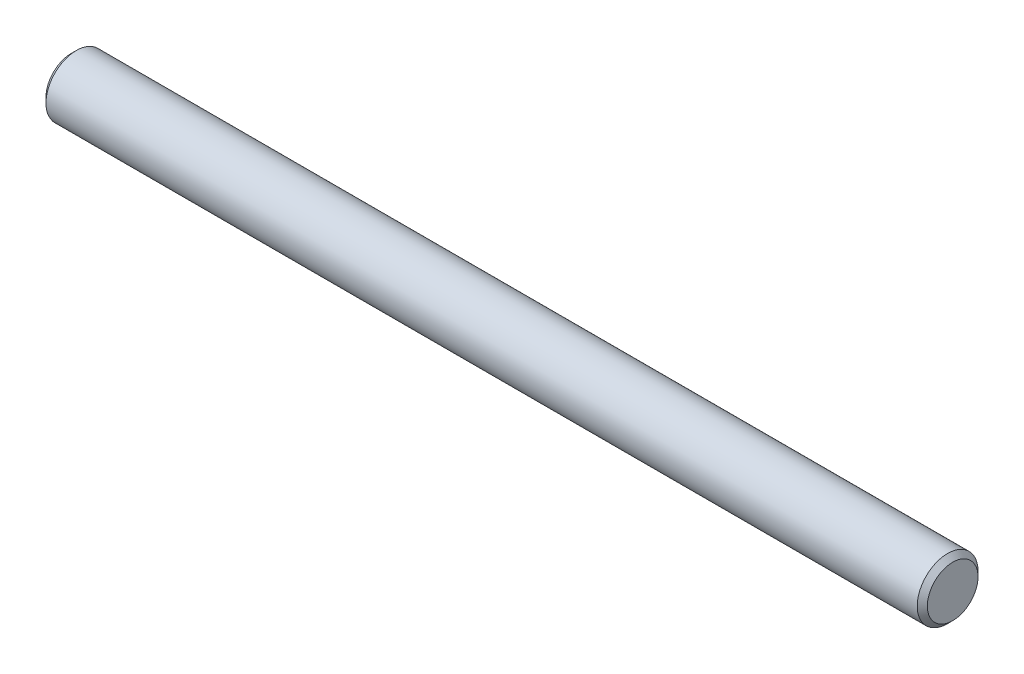
ISO-10303-21;
HEADER;
FILE_DESCRIPTION(('STEP AP214'),'2;1');
FILE_NAME('part.step','',(''),(''),'','','');
FILE_SCHEMA(('AUTOMOTIVE_DESIGN { 1 0 10303 214 1 1 1 1 }'));
ENDSEC;
DATA;
#1=APPLICATION_CONTEXT('core data for automotive mechanical design processes');
#2=APPLICATION_PROTOCOL_DEFINITION('international standard','automotive_design',2000,#1);
#3=PRODUCT_CONTEXT('',#1,'mechanical');
#4=PRODUCT('Part','Part','',(#3));
#5=PRODUCT_RELATED_PRODUCT_CATEGORY('part','',(#4));
#6=PRODUCT_DEFINITION_FORMATION('','',#4);
#7=PRODUCT_DEFINITION_CONTEXT('part definition',#1,'design');
#8=PRODUCT_DEFINITION('design','',#6,#7);
#9=PRODUCT_DEFINITION_SHAPE('','',#8);
#10=(LENGTH_UNIT() NAMED_UNIT(*) SI_UNIT(.MILLI.,.METRE.));
#11=(NAMED_UNIT(*) PLANE_ANGLE_UNIT() SI_UNIT($,.RADIAN.));
#12=(NAMED_UNIT(*) SI_UNIT($,.STERADIAN.) SOLID_ANGLE_UNIT());
#13=UNCERTAINTY_MEASURE_WITH_UNIT(LENGTH_MEASURE(1.E-05),#10,'distance_accuracy_value','');
#14=(GEOMETRIC_REPRESENTATION_CONTEXT(3) GLOBAL_UNCERTAINTY_ASSIGNED_CONTEXT((#13)) GLOBAL_UNIT_ASSIGNED_CONTEXT((#10,
#11,#12)) REPRESENTATION_CONTEXT('',''));
#15=CARTESIAN_POINT('',(0.,0.,0.));
#16=DIRECTION('',(0.,0.,1.));
#17=DIRECTION('',(1.,0.,0.));
#18=AXIS2_PLACEMENT_3D('',#15,#16,#17);
#19=CARTESIAN_POINT('',(174.,0.,0.));
#20=DIRECTION('',(-1.,0.,0.));
#21=DIRECTION('',(0.,0.,1.));
#22=AXIS2_PLACEMENT_3D('',#19,#20,#21);
#23=CYLINDRICAL_SURFACE('',#22,6.);
#24=CARTESIAN_POINT('',(173.,0.,0.));
#25=DIRECTION('',(1.,0.,0.));
#26=DIRECTION('',(0.,0.,-1.));
#27=AXIS2_PLACEMENT_3D('',#24,#25,#26);
#28=CIRCLE('',#27,6.);
#29=CARTESIAN_POINT('',(173.,0.,-6.));
#30=VERTEX_POINT('',#29);
#31=EDGE_CURVE('E38',#30,#30,#28,.F.);
#32=ORIENTED_EDGE('',*,*,#31,.T.);
#33=EDGE_LOOP('',(#32));
#34=FACE_BOUND('',#33,.T.);
#35=CARTESIAN_POINT('',(1.00000000000003,0.,0.));
#36=DIRECTION('',(1.,0.,0.));
#37=DIRECTION('',(0.,0.,-1.));
#38=AXIS2_PLACEMENT_3D('',#35,#36,#37);
#39=CIRCLE('',#38,6.);
#40=CARTESIAN_POINT('',(1.00000000000003,0.,-6.));
#41=VERTEX_POINT('',#40);
#42=EDGE_CURVE('E42',#41,#41,#39,.T.);
#43=ORIENTED_EDGE('',*,*,#42,.T.);
#44=EDGE_LOOP('',(#43));
#45=FACE_BOUND('',#44,.T.);
#46=ADVANCED_FACE('F31',(#34,#45),#23,.T.);
#47=CARTESIAN_POINT('',(174.,0.,0.));
#48=DIRECTION('',(1.,0.,0.));
#49=DIRECTION('',(0.,0.,-1.));
#50=AXIS2_PLACEMENT_3D('',#47,#48,#49);
#51=PLANE('',#50);
#52=CARTESIAN_POINT('',(174.,0.,0.));
#53=DIRECTION('',(1.,0.,0.));
#54=DIRECTION('',(0.,0.,-1.));
#55=AXIS2_PLACEMENT_3D('',#52,#53,#54);
#56=CIRCLE('',#55,4.99999999999999);
#57=CARTESIAN_POINT('',(174.,0.,-4.99999999999999));
#58=VERTEX_POINT('',#57);
#59=EDGE_CURVE('E46',#58,#58,#56,.T.);
#60=ORIENTED_EDGE('',*,*,#59,.T.);
#61=EDGE_LOOP('',(#60));
#62=FACE_BOUND('',#61,.T.);
#63=ADVANCED_FACE('F52',(#62),#51,.T.);
#64=CARTESIAN_POINT('',(0.,0.,0.));
#65=DIRECTION('',(1.,0.,0.));
#66=DIRECTION('',(0.,0.,-1.));
#67=AXIS2_PLACEMENT_3D('',#64,#65,#66);
#68=PLANE('',#67);
#69=CARTESIAN_POINT('',(0.,0.,0.));
#70=DIRECTION('',(1.,0.,0.));
#71=DIRECTION('',(0.,0.,-1.));
#72=AXIS2_PLACEMENT_3D('',#69,#70,#71);
#73=CIRCLE('',#72,4.99999999999998);
#74=CARTESIAN_POINT('',(0.,0.,-4.99999999999998));
#75=VERTEX_POINT('',#74);
#76=EDGE_CURVE('E10',#75,#75,#73,.F.);
#77=ORIENTED_EDGE('',*,*,#76,.T.);
#78=EDGE_LOOP('',(#77));
#79=FACE_BOUND('',#78,.T.);
#80=ADVANCED_FACE('F56',(#79),#68,.F.);
#81=CARTESIAN_POINT('',(174.,0.,0.));
#82=DIRECTION('',(-1.,0.,0.));
#83=DIRECTION('',(0.,0.,1.));
#84=AXIS2_PLACEMENT_3D('',#81,#82,#83);
#85=CONICAL_SURFACE('',#84,4.99999999999999,0.785398163397439);
#86=ORIENTED_EDGE('',*,*,#31,.F.);
#87=EDGE_LOOP('',(#86));
#88=FACE_BOUND('',#87,.T.);
#89=ORIENTED_EDGE('',*,*,#59,.F.);
#90=EDGE_LOOP('',(#89));
#91=FACE_BOUND('',#90,.T.);
#92=ADVANCED_FACE('F54',(#88,#91),#85,.T.);
#93=CARTESIAN_POINT('',(1.00000000000003,0.,0.));
#94=DIRECTION('',(1.,0.,0.));
#95=DIRECTION('',(0.,0.,-1.));
#96=AXIS2_PLACEMENT_3D('',#93,#94,#95);
#97=CONICAL_SURFACE('',#96,6.,0.785398163397446);
#98=ORIENTED_EDGE('',*,*,#76,.F.);
#99=EDGE_LOOP('',(#98));
#100=FACE_BOUND('',#99,.T.);
#101=ORIENTED_EDGE('',*,*,#42,.F.);
#102=EDGE_LOOP('',(#101));
#103=FACE_BOUND('',#102,.T.);
#104=ADVANCED_FACE('F33',(#100,#103),#97,.T.);
#105=CLOSED_SHELL('',(#46,#63,#80,#92,#104));
#106=MANIFOLD_SOLID_BREP('B2',#105);
#107=ADVANCED_BREP_SHAPE_REPRESENTATION('',(#18,#106),#14);
#108=SHAPE_DEFINITION_REPRESENTATION(#9,#107);
ENDSEC;
END-ISO-10303-21;
